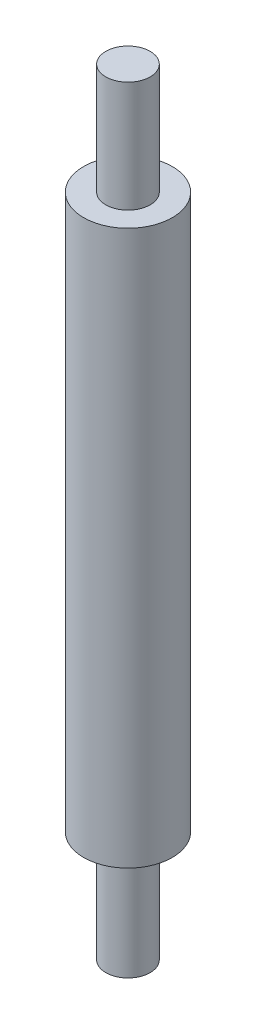
ISO-10303-21;
HEADER;
FILE_DESCRIPTION(('STEP AP214'),'2;1');
FILE_NAME('part.step','',(''),(''),'','','');
FILE_SCHEMA(('AUTOMOTIVE_DESIGN { 1 0 10303 214 1 1 1 1 }'));
ENDSEC;
DATA;
#1=APPLICATION_CONTEXT('core data for automotive mechanical design processes');
#2=APPLICATION_PROTOCOL_DEFINITION('international standard','automotive_design',2000,#1);
#3=PRODUCT_CONTEXT('',#1,'mechanical');
#4=PRODUCT('Part','Part','',(#3));
#5=PRODUCT_RELATED_PRODUCT_CATEGORY('part','',(#4));
#6=PRODUCT_DEFINITION_FORMATION('','',#4);
#7=PRODUCT_DEFINITION_CONTEXT('part definition',#1,'design');
#8=PRODUCT_DEFINITION('design','',#6,#7);
#9=PRODUCT_DEFINITION_SHAPE('','',#8);
#10=(LENGTH_UNIT() NAMED_UNIT(*) SI_UNIT(.MILLI.,.METRE.));
#11=(NAMED_UNIT(*) PLANE_ANGLE_UNIT() SI_UNIT($,.RADIAN.));
#12=(NAMED_UNIT(*) SI_UNIT($,.STERADIAN.) SOLID_ANGLE_UNIT());
#13=UNCERTAINTY_MEASURE_WITH_UNIT(LENGTH_MEASURE(1.E-05),#10,'distance_accuracy_value','');
#14=(GEOMETRIC_REPRESENTATION_CONTEXT(3) GLOBAL_UNCERTAINTY_ASSIGNED_CONTEXT((#13)) GLOBAL_UNIT_ASSIGNED_CONTEXT((#10,
#11,#12)) REPRESENTATION_CONTEXT('',''));
#15=CARTESIAN_POINT('',(0.,0.,0.));
#16=DIRECTION('',(0.,0.,1.));
#17=DIRECTION('',(1.,0.,0.));
#18=AXIS2_PLACEMENT_3D('',#15,#16,#17);
#19=CARTESIAN_POINT('',(0.,35.,0.));
#20=DIRECTION('',(0.,-1.,0.));
#21=DIRECTION('',(0.,0.,-1.));
#22=AXIS2_PLACEMENT_3D('',#19,#20,#21);
#23=PLANE('',#22);
#24=CARTESIAN_POINT('',(0.,35.,0.));
#25=DIRECTION('',(0.,1.,0.));
#26=DIRECTION('',(0.,0.,1.));
#27=AXIS2_PLACEMENT_3D('',#24,#25,#26);
#28=CIRCLE('',#27,2.);
#29=CARTESIAN_POINT('',(0.,35.,2.));
#30=VERTEX_POINT('',#29);
#31=EDGE_CURVE('E10',#30,#30,#28,.T.);
#32=ORIENTED_EDGE('',*,*,#31,.T.);
#33=EDGE_LOOP('',(#32));
#34=FACE_BOUND('',#33,.T.);
#35=ADVANCED_FACE('F43',(#34),#23,.F.);
#36=CARTESIAN_POINT('',(0.,41.4863063476217,0.));
#37=DIRECTION('',(0.,1.,0.));
#38=DIRECTION('',(0.,0.,1.));
#39=AXIS2_PLACEMENT_3D('',#36,#37,#38);
#40=CYLINDRICAL_SURFACE('',#39,2.);
#41=ORIENTED_EDGE('',*,*,#31,.F.);
#42=EDGE_LOOP('',(#41));
#43=FACE_BOUND('',#42,.T.);
#44=CARTESIAN_POINT('',(0.,25.,0.));
#45=DIRECTION('',(0.,1.,0.));
#46=DIRECTION('',(0.,0.,1.));
#47=AXIS2_PLACEMENT_3D('',#44,#45,#46);
#48=CIRCLE('',#47,2.00000000000001);
#49=CARTESIAN_POINT('',(0.,25.,2.00000000000001));
#50=VERTEX_POINT('',#49);
#51=EDGE_CURVE('E50',#50,#50,#48,.T.);
#52=ORIENTED_EDGE('',*,*,#51,.T.);
#53=EDGE_LOOP('',(#52));
#54=FACE_BOUND('',#53,.T.);
#55=ADVANCED_FACE('F87',(#43,#54),#40,.T.);
#56=CARTESIAN_POINT('',(2.00000000000001,25.,0.));
#57=DIRECTION('',(0.,-1.,0.));
#58=DIRECTION('',(0.,0.,-1.));
#59=AXIS2_PLACEMENT_3D('',#56,#57,#58);
#60=PLANE('',#59);
#61=ORIENTED_EDGE('',*,*,#51,.F.);
#62=EDGE_LOOP('',(#61));
#63=FACE_BOUND('',#62,.T.);
#64=CARTESIAN_POINT('',(0.,25.,0.));
#65=DIRECTION('',(0.,1.,0.));
#66=DIRECTION('',(0.,0.,1.));
#67=AXIS2_PLACEMENT_3D('',#64,#65,#66);
#68=CIRCLE('',#67,4.00000000000001);
#69=CARTESIAN_POINT('',(0.,25.,4.00000000000001));
#70=VERTEX_POINT('',#69);
#71=EDGE_CURVE('E55',#70,#70,#68,.T.);
#72=ORIENTED_EDGE('',*,*,#71,.T.);
#73=EDGE_LOOP('',(#72));
#74=FACE_BOUND('',#73,.T.);
#75=ADVANCED_FACE('F91',(#63,#74),#60,.F.);
#76=CARTESIAN_POINT('',(0.,41.4863063476217,0.));
#77=DIRECTION('',(0.,1.,0.));
#78=DIRECTION('',(0.,0.,1.));
#79=AXIS2_PLACEMENT_3D('',#76,#77,#78);
#80=CYLINDRICAL_SURFACE('',#79,4.00000000000001);
#81=ORIENTED_EDGE('',*,*,#71,.F.);
#82=EDGE_LOOP('',(#81));
#83=FACE_BOUND('',#82,.T.);
#84=CARTESIAN_POINT('',(0.,-25.,0.));
#85=DIRECTION('',(0.,1.,0.));
#86=DIRECTION('',(0.,0.,1.));
#87=AXIS2_PLACEMENT_3D('',#84,#85,#86);
#88=CIRCLE('',#87,4.00000000000001);
#89=CARTESIAN_POINT('',(0.,-25.,4.00000000000001));
#90=VERTEX_POINT('',#89);
#91=EDGE_CURVE('E60',#90,#90,#88,.T.);
#92=ORIENTED_EDGE('',*,*,#91,.T.);
#93=EDGE_LOOP('',(#92));
#94=FACE_BOUND('',#93,.T.);
#95=ADVANCED_FACE('F96',(#83,#94),#80,.T.);
#96=CARTESIAN_POINT('',(4.00000000000001,-25.,0.));
#97=DIRECTION('',(0.,1.,0.));
#98=DIRECTION('',(0.,0.,1.));
#99=AXIS2_PLACEMENT_3D('',#96,#97,#98);
#100=PLANE('',#99);
#101=ORIENTED_EDGE('',*,*,#91,.F.);
#102=EDGE_LOOP('',(#101));
#103=FACE_BOUND('',#102,.T.);
#104=CARTESIAN_POINT('',(0.,-25.,0.));
#105=DIRECTION('',(0.,1.,0.));
#106=DIRECTION('',(0.,0.,1.));
#107=AXIS2_PLACEMENT_3D('',#104,#105,#106);
#108=CIRCLE('',#107,2.00000000000001);
#109=CARTESIAN_POINT('',(0.,-25.,2.00000000000001));
#110=VERTEX_POINT('',#109);
#111=EDGE_CURVE('E66',#110,#110,#108,.T.);
#112=ORIENTED_EDGE('',*,*,#111,.T.);
#113=EDGE_LOOP('',(#112));
#114=FACE_BOUND('',#113,.T.);
#115=ADVANCED_FACE('F83',(#103,#114),#100,.F.);
#116=CARTESIAN_POINT('',(0.,41.4863063476217,0.));
#117=DIRECTION('',(0.,1.,0.));
#118=DIRECTION('',(0.,0.,1.));
#119=AXIS2_PLACEMENT_3D('',#116,#117,#118);
#120=CYLINDRICAL_SURFACE('',#119,2.00000000000001);
#121=ORIENTED_EDGE('',*,*,#111,.F.);
#122=EDGE_LOOP('',(#121));
#123=FACE_BOUND('',#122,.T.);
#124=CARTESIAN_POINT('',(0.,-35.,0.));
#125=DIRECTION('',(0.,1.,0.));
#126=DIRECTION('',(0.,0.,1.));
#127=AXIS2_PLACEMENT_3D('',#124,#125,#126);
#128=CIRCLE('',#127,2.00000000000001);
#129=CARTESIAN_POINT('',(0.,-35.,2.00000000000001));
#130=VERTEX_POINT('',#129);
#131=EDGE_CURVE('E70',#130,#130,#128,.T.);
#132=ORIENTED_EDGE('',*,*,#131,.T.);
#133=EDGE_LOOP('',(#132));
#134=FACE_BOUND('',#133,.T.);
#135=ADVANCED_FACE('F75',(#123,#134),#120,.T.);
#136=CARTESIAN_POINT('',(2.00000000000001,-35.,0.));
#137=DIRECTION('',(0.,1.,0.));
#138=DIRECTION('',(0.,0.,1.));
#139=AXIS2_PLACEMENT_3D('',#136,#137,#138);
#140=PLANE('',#139);
#141=ORIENTED_EDGE('',*,*,#131,.F.);
#142=EDGE_LOOP('',(#141));
#143=FACE_BOUND('',#142,.T.);
#144=ADVANCED_FACE('F77',(#143),#140,.F.);
#145=CLOSED_SHELL('',(#35,#55,#75,#95,#115,#135,#144));
#146=MANIFOLD_SOLID_BREP('B2',#145);
#147=ADVANCED_BREP_SHAPE_REPRESENTATION('',(#18,#146),#14);
#148=SHAPE_DEFINITION_REPRESENTATION(#9,#147);
ENDSEC;
END-ISO-10303-21;
